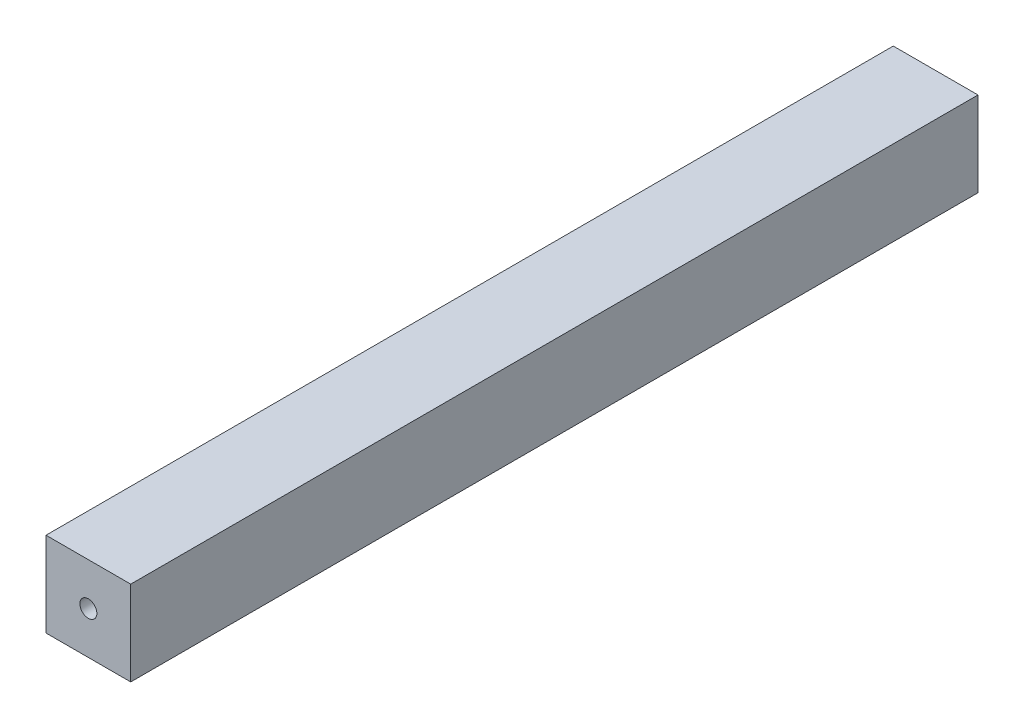
ISO-10303-21;
HEADER;
FILE_DESCRIPTION(('STEP AP214'),'2;1');
FILE_NAME('part.step','',(''),(''),'','','');
FILE_SCHEMA(('AUTOMOTIVE_DESIGN { 1 0 10303 214 1 1 1 1 }'));
ENDSEC;
DATA;
#1=APPLICATION_CONTEXT('core data for automotive mechanical design processes');
#2=APPLICATION_PROTOCOL_DEFINITION('international standard','automotive_design',2000,#1);
#3=PRODUCT_CONTEXT('',#1,'mechanical');
#4=PRODUCT('Part','Part','',(#3));
#5=PRODUCT_RELATED_PRODUCT_CATEGORY('part','',(#4));
#6=PRODUCT_DEFINITION_FORMATION('','',#4);
#7=PRODUCT_DEFINITION_CONTEXT('part definition',#1,'design');
#8=PRODUCT_DEFINITION('design','',#6,#7);
#9=PRODUCT_DEFINITION_SHAPE('','',#8);
#10=(LENGTH_UNIT() NAMED_UNIT(*) SI_UNIT(.MILLI.,.METRE.));
#11=(NAMED_UNIT(*) PLANE_ANGLE_UNIT() SI_UNIT($,.RADIAN.));
#12=(NAMED_UNIT(*) SI_UNIT($,.STERADIAN.) SOLID_ANGLE_UNIT());
#13=UNCERTAINTY_MEASURE_WITH_UNIT(LENGTH_MEASURE(1.E-05),#10,'distance_accuracy_value','');
#14=(GEOMETRIC_REPRESENTATION_CONTEXT(3) GLOBAL_UNCERTAINTY_ASSIGNED_CONTEXT((#13)) GLOBAL_UNIT_ASSIGNED_CONTEXT((#10,
#11,#12)) REPRESENTATION_CONTEXT('',''));
#15=CARTESIAN_POINT('',(0.,0.,0.));
#16=DIRECTION('',(0.,0.,1.));
#17=DIRECTION('',(1.,0.,0.));
#18=AXIS2_PLACEMENT_3D('',#15,#16,#17);
#19=CARTESIAN_POINT('',(-12.5,12.5,250.));
#20=DIRECTION('',(1.,0.,0.));
#21=DIRECTION('',(0.,0.,-1.));
#22=AXIS2_PLACEMENT_3D('',#19,#20,#21);
#23=PLANE('',#22);
#24=DIRECTION('',(0.,-1.,0.));
#25=VECTOR('',#24,1.);
#26=CARTESIAN_POINT('',(-12.5,12.5,0.));
#27=LINE('',#26,#25);
#28=CARTESIAN_POINT('',(-12.5,12.5,0.));
#29=VERTEX_POINT('',#28);
#30=CARTESIAN_POINT('',(-12.5,-12.5,0.));
#31=VERTEX_POINT('',#30);
#32=EDGE_CURVE('E107',#29,#31,#27,.T.);
#33=ORIENTED_EDGE('',*,*,#32,.T.);
#34=DIRECTION('',(0.,0.,-1.));
#35=VECTOR('',#34,1.);
#36=CARTESIAN_POINT('',(-12.5,-12.5,250.));
#37=LINE('',#36,#35);
#38=CARTESIAN_POINT('',(-12.5,-12.5,250.));
#39=VERTEX_POINT('',#38);
#40=EDGE_CURVE('E11',#39,#31,#37,.T.);
#41=ORIENTED_EDGE('',*,*,#40,.F.);
#42=DIRECTION('',(0.,-1.,0.));
#43=VECTOR('',#42,1.);
#44=CARTESIAN_POINT('',(-12.5,12.5,250.));
#45=LINE('',#44,#43);
#46=CARTESIAN_POINT('',(-12.5,12.5,250.));
#47=VERTEX_POINT('',#46);
#48=EDGE_CURVE('E91',#47,#39,#45,.T.);
#49=ORIENTED_EDGE('',*,*,#48,.F.);
#50=DIRECTION('',(0.,0.,-1.));
#51=VECTOR('',#50,1.);
#52=CARTESIAN_POINT('',(-12.5,12.5,250.));
#53=LINE('',#52,#51);
#54=EDGE_CURVE('E103',#47,#29,#53,.T.);
#55=ORIENTED_EDGE('',*,*,#54,.T.);
#56=EDGE_LOOP('',(#33,#41,#49,#55));
#57=FACE_BOUND('',#56,.T.);
#58=ADVANCED_FACE('F39',(#57),#23,.F.);
#59=CARTESIAN_POINT('',(-12.5,-12.5,250.));
#60=DIRECTION('',(0.,1.,0.));
#61=DIRECTION('',(0.,0.,1.));
#62=AXIS2_PLACEMENT_3D('',#59,#60,#61);
#63=PLANE('',#62);
#64=DIRECTION('',(1.,0.,0.));
#65=VECTOR('',#64,1.);
#66=CARTESIAN_POINT('',(-12.5,-12.5,0.));
#67=LINE('',#66,#65);
#68=CARTESIAN_POINT('',(12.5,-12.5,0.));
#69=VERTEX_POINT('',#68);
#70=EDGE_CURVE('E96',#31,#69,#67,.T.);
#71=ORIENTED_EDGE('',*,*,#70,.T.);
#72=DIRECTION('',(0.,0.,-1.));
#73=VECTOR('',#72,1.);
#74=CARTESIAN_POINT('',(12.5,-12.5,250.));
#75=LINE('',#74,#73);
#76=CARTESIAN_POINT('',(12.5,-12.5,250.));
#77=VERTEX_POINT('',#76);
#78=EDGE_CURVE('E48',#77,#69,#75,.T.);
#79=ORIENTED_EDGE('',*,*,#78,.F.);
#80=DIRECTION('',(1.,0.,0.));
#81=VECTOR('',#80,1.);
#82=CARTESIAN_POINT('',(-12.5,-12.5,250.));
#83=LINE('',#82,#81);
#84=EDGE_CURVE('E86',#39,#77,#83,.T.);
#85=ORIENTED_EDGE('',*,*,#84,.F.);
#86=ORIENTED_EDGE('',*,*,#40,.T.);
#87=EDGE_LOOP('',(#71,#79,#85,#86));
#88=FACE_BOUND('',#87,.T.);
#89=ADVANCED_FACE('F95',(#88),#63,.F.);
#90=CARTESIAN_POINT('',(12.5,12.5,250.));
#91=DIRECTION('',(-1.,0.,0.));
#92=DIRECTION('',(0.,-1.,0.));
#93=AXIS2_PLACEMENT_3D('',#90,#91,#92);
#94=PLANE('',#93);
#95=DIRECTION('',(0.,1.,0.));
#96=VECTOR('',#95,1.);
#97=CARTESIAN_POINT('',(12.5,12.5,0.));
#98=LINE('',#97,#96);
#99=CARTESIAN_POINT('',(12.5,12.5,0.));
#100=VERTEX_POINT('',#99);
#101=EDGE_CURVE('E73',#69,#100,#98,.T.);
#102=ORIENTED_EDGE('',*,*,#101,.T.);
#103=DIRECTION('',(0.,0.,-1.));
#104=VECTOR('',#103,1.);
#105=CARTESIAN_POINT('',(12.5,12.5,250.));
#106=LINE('',#105,#104);
#107=CARTESIAN_POINT('',(12.5,12.5,250.));
#108=VERTEX_POINT('',#107);
#109=EDGE_CURVE('E98',#108,#100,#106,.T.);
#110=ORIENTED_EDGE('',*,*,#109,.F.);
#111=DIRECTION('',(0.,1.,0.));
#112=VECTOR('',#111,1.);
#113=CARTESIAN_POINT('',(12.5,12.5,250.));
#114=LINE('',#113,#112);
#115=EDGE_CURVE('E89',#77,#108,#114,.T.);
#116=ORIENTED_EDGE('',*,*,#115,.F.);
#117=ORIENTED_EDGE('',*,*,#78,.T.);
#118=EDGE_LOOP('',(#102,#110,#116,#117));
#119=FACE_BOUND('',#118,.T.);
#120=ADVANCED_FACE('F99',(#119),#94,.F.);
#121=CARTESIAN_POINT('',(-12.5,12.5,250.));
#122=DIRECTION('',(0.,-1.,0.));
#123=DIRECTION('',(0.,0.,-1.));
#124=AXIS2_PLACEMENT_3D('',#121,#122,#123);
#125=PLANE('',#124);
#126=DIRECTION('',(-1.,0.,0.));
#127=VECTOR('',#126,1.);
#128=CARTESIAN_POINT('',(-12.5,12.5,0.));
#129=LINE('',#128,#127);
#130=EDGE_CURVE('E79',#100,#29,#129,.T.);
#131=ORIENTED_EDGE('',*,*,#130,.T.);
#132=ORIENTED_EDGE('',*,*,#54,.F.);
#133=DIRECTION('',(-1.,0.,0.));
#134=VECTOR('',#133,1.);
#135=CARTESIAN_POINT('',(-12.5,12.5,250.));
#136=LINE('',#135,#134);
#137=EDGE_CURVE('E56',#108,#47,#136,.T.);
#138=ORIENTED_EDGE('',*,*,#137,.F.);
#139=ORIENTED_EDGE('',*,*,#109,.T.);
#140=EDGE_LOOP('',(#131,#132,#138,#139));
#141=FACE_BOUND('',#140,.T.);
#142=ADVANCED_FACE('F121',(#141),#125,.F.);
#143=CARTESIAN_POINT('',(0.,0.,250.));
#144=DIRECTION('',(0.,0.,1.));
#145=DIRECTION('',(1.,0.,0.));
#146=AXIS2_PLACEMENT_3D('',#143,#144,#145);
#147=PLANE('',#146);
#148=CARTESIAN_POINT('',(0.,0.,250.));
#149=DIRECTION('',(0.,0.,1.));
#150=DIRECTION('',(1.,0.,0.));
#151=AXIS2_PLACEMENT_3D('',#148,#149,#150);
#152=CIRCLE('',#151,2.5);
#153=CARTESIAN_POINT('',(2.5,0.,250.));
#154=VERTEX_POINT('',#153);
#155=EDGE_CURVE('E111',#154,#154,#152,.T.);
#156=ORIENTED_EDGE('',*,*,#155,.F.);
#157=EDGE_LOOP('',(#156));
#158=FACE_BOUND('',#157,.T.);
#159=ORIENTED_EDGE('',*,*,#48,.T.);
#160=ORIENTED_EDGE('',*,*,#84,.T.);
#161=ORIENTED_EDGE('',*,*,#115,.T.);
#162=ORIENTED_EDGE('',*,*,#137,.T.);
#163=EDGE_LOOP('',(#159,#160,#161,#162));
#164=FACE_BOUND('',#163,.T.);
#165=ADVANCED_FACE('F87',(#158,#164),#147,.T.);
#166=CARTESIAN_POINT('',(0.,0.,0.));
#167=DIRECTION('',(0.,0.,1.));
#168=DIRECTION('',(1.,0.,0.));
#169=AXIS2_PLACEMENT_3D('',#166,#167,#168);
#170=PLANE('',#169);
#171=CARTESIAN_POINT('',(0.,0.,0.));
#172=DIRECTION('',(0.,0.,1.));
#173=DIRECTION('',(1.,0.,0.));
#174=AXIS2_PLACEMENT_3D('',#171,#172,#173);
#175=CIRCLE('',#174,2.5);
#176=CARTESIAN_POINT('',(2.5,0.,0.));
#177=VERTEX_POINT('',#176);
#178=EDGE_CURVE('E128',#177,#177,#175,.T.);
#179=ORIENTED_EDGE('',*,*,#178,.T.);
#180=EDGE_LOOP('',(#179));
#181=FACE_BOUND('',#180,.T.);
#182=ORIENTED_EDGE('',*,*,#32,.F.);
#183=ORIENTED_EDGE('',*,*,#130,.F.);
#184=ORIENTED_EDGE('',*,*,#101,.F.);
#185=ORIENTED_EDGE('',*,*,#70,.F.);
#186=EDGE_LOOP('',(#182,#183,#184,#185));
#187=FACE_BOUND('',#186,.T.);
#188=ADVANCED_FACE('F124',(#181,#187),#170,.F.);
#189=CARTESIAN_POINT('',(0.,0.,250.));
#190=DIRECTION('',(0.,0.,-1.));
#191=DIRECTION('',(-1.,0.,0.));
#192=AXIS2_PLACEMENT_3D('',#189,#190,#191);
#193=CYLINDRICAL_SURFACE('',#192,2.5);
#194=ORIENTED_EDGE('',*,*,#155,.T.);
#195=EDGE_LOOP('',(#194));
#196=FACE_BOUND('',#195,.T.);
#197=ORIENTED_EDGE('',*,*,#178,.F.);
#198=EDGE_LOOP('',(#197));
#199=FACE_BOUND('',#198,.T.);
#200=ADVANCED_FACE('F136',(#196,#199),#193,.F.);
#201=CLOSED_SHELL('',(#58,#89,#120,#142,#165,#188,#200));
#202=MANIFOLD_SOLID_BREP('B2',#201);
#203=ADVANCED_BREP_SHAPE_REPRESENTATION('',(#18,#202),#14);
#204=SHAPE_DEFINITION_REPRESENTATION(#9,#203);
ENDSEC;
END-ISO-10303-21;
